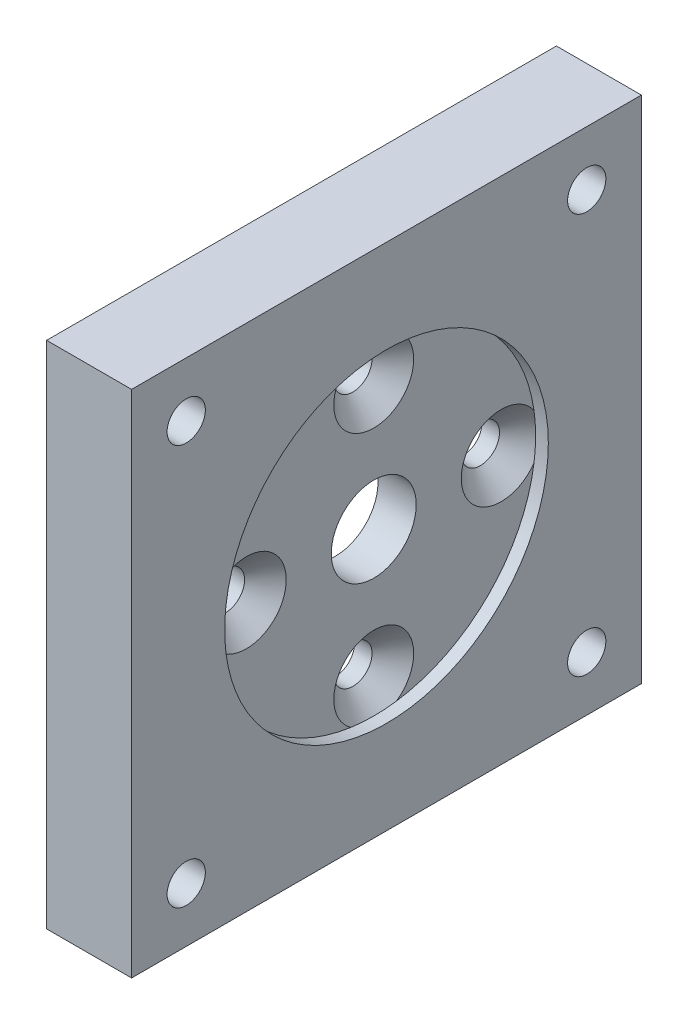
ISO-10303-21;
HEADER;
FILE_DESCRIPTION(('STEP AP214'),'2;1');
FILE_NAME('part.step','',(''),(''),'','','');
FILE_SCHEMA(('AUTOMOTIVE_DESIGN { 1 0 10303 214 1 1 1 1 }'));
ENDSEC;
DATA;
#1=APPLICATION_CONTEXT('core data for automotive mechanical design processes');
#2=APPLICATION_PROTOCOL_DEFINITION('international standard','automotive_design',2000,#1);
#3=PRODUCT_CONTEXT('',#1,'mechanical');
#4=PRODUCT('Part','Part','',(#3));
#5=PRODUCT_RELATED_PRODUCT_CATEGORY('part','',(#4));
#6=PRODUCT_DEFINITION_FORMATION('','',#4);
#7=PRODUCT_DEFINITION_CONTEXT('part definition',#1,'design');
#8=PRODUCT_DEFINITION('design','',#6,#7);
#9=PRODUCT_DEFINITION_SHAPE('','',#8);
#10=(LENGTH_UNIT() NAMED_UNIT(*) SI_UNIT(.MILLI.,.METRE.));
#11=(NAMED_UNIT(*) PLANE_ANGLE_UNIT() SI_UNIT($,.RADIAN.));
#12=(NAMED_UNIT(*) SI_UNIT($,.STERADIAN.) SOLID_ANGLE_UNIT());
#13=UNCERTAINTY_MEASURE_WITH_UNIT(LENGTH_MEASURE(1.E-05),#10,'distance_accuracy_value','');
#14=(GEOMETRIC_REPRESENTATION_CONTEXT(3) GLOBAL_UNCERTAINTY_ASSIGNED_CONTEXT((#13)) GLOBAL_UNIT_ASSIGNED_CONTEXT((#10,
#11,#12)) REPRESENTATION_CONTEXT('',''));
#15=CARTESIAN_POINT('',(0.,0.,0.));
#16=DIRECTION('',(0.,0.,1.));
#17=DIRECTION('',(1.,0.,0.));
#18=AXIS2_PLACEMENT_3D('',#15,#16,#17);
#19=CARTESIAN_POINT('',(0.,0.,0.));
#20=DIRECTION('',(1.,0.,0.));
#21=DIRECTION('',(0.,0.,-1.));
#22=AXIS2_PLACEMENT_3D('',#19,#20,#21);
#23=CYLINDRICAL_SURFACE('',#22,5.);
#24=CARTESIAN_POINT('',(8.5,0.,0.));
#25=DIRECTION('',(1.,0.,0.));
#26=DIRECTION('',(0.,0.,-1.));
#27=AXIS2_PLACEMENT_3D('',#24,#25,#26);
#28=CIRCLE('',#27,5.);
#29=CARTESIAN_POINT('',(8.5,0.,-5.));
#30=VERTEX_POINT('',#29);
#31=EDGE_CURVE('E130',#30,#30,#28,.F.);
#32=ORIENTED_EDGE('',*,*,#31,.F.);
#33=EDGE_LOOP('',(#32));
#34=FACE_BOUND('',#33,.T.);
#35=CARTESIAN_POINT('',(4.,0.,0.));
#36=DIRECTION('',(-1.,0.,0.));
#37=DIRECTION('',(0.,0.,1.));
#38=AXIS2_PLACEMENT_3D('',#35,#36,#37);
#39=CIRCLE('',#38,5.);
#40=CARTESIAN_POINT('',(4.,0.,5.));
#41=VERTEX_POINT('',#40);
#42=EDGE_CURVE('E142',#41,#41,#39,.F.);
#43=ORIENTED_EDGE('',*,*,#42,.F.);
#44=EDGE_LOOP('',(#43));
#45=FACE_BOUND('',#44,.T.);
#46=ADVANCED_FACE('F39',(#34,#45),#23,.F.);
#47=CARTESIAN_POINT('',(10.,30.,-30.));
#48=DIRECTION('',(0.,0.,1.));
#49=DIRECTION('',(0.,-1.,0.));
#50=AXIS2_PLACEMENT_3D('',#47,#48,#49);
#51=PLANE('',#50);
#52=DIRECTION('',(0.,1.,0.));
#53=VECTOR('',#52,1.);
#54=CARTESIAN_POINT('',(0.,30.,-30.));
#55=LINE('',#54,#53);
#56=CARTESIAN_POINT('',(0.,-30.,-30.));
#57=VERTEX_POINT('',#56);
#58=CARTESIAN_POINT('',(0.,30.,-30.));
#59=VERTEX_POINT('',#58);
#60=EDGE_CURVE('E133',#57,#59,#55,.T.);
#61=ORIENTED_EDGE('',*,*,#60,.T.);
#62=DIRECTION('',(-1.,0.,0.));
#63=VECTOR('',#62,1.);
#64=CARTESIAN_POINT('',(10.,30.,-30.));
#65=LINE('',#64,#63);
#66=CARTESIAN_POINT('',(10.,30.,-30.));
#67=VERTEX_POINT('',#66);
#68=EDGE_CURVE('E11',#67,#59,#65,.T.);
#69=ORIENTED_EDGE('',*,*,#68,.F.);
#70=DIRECTION('',(0.,1.,0.));
#71=VECTOR('',#70,1.);
#72=CARTESIAN_POINT('',(10.,30.,-30.));
#73=LINE('',#72,#71);
#74=CARTESIAN_POINT('',(10.,-30.,-30.));
#75=VERTEX_POINT('',#74);
#76=EDGE_CURVE('E230',#75,#67,#73,.T.);
#77=ORIENTED_EDGE('',*,*,#76,.F.);
#78=DIRECTION('',(-1.,0.,0.));
#79=VECTOR('',#78,1.);
#80=CARTESIAN_POINT('',(10.,-30.,-30.));
#81=LINE('',#80,#79);
#82=EDGE_CURVE('E231',#75,#57,#81,.T.);
#83=ORIENTED_EDGE('',*,*,#82,.T.);
#84=EDGE_LOOP('',(#61,#69,#77,#83));
#85=FACE_BOUND('',#84,.T.);
#86=ADVANCED_FACE('F41',(#85),#51,.F.);
#87=CARTESIAN_POINT('',(10.,30.,30.));
#88=DIRECTION('',(0.,-1.,0.));
#89=DIRECTION('',(0.,0.,-1.));
#90=AXIS2_PLACEMENT_3D('',#87,#88,#89);
#91=PLANE('',#90);
#92=DIRECTION('',(0.,0.,1.));
#93=VECTOR('',#92,1.);
#94=CARTESIAN_POINT('',(0.,30.,30.));
#95=LINE('',#94,#93);
#96=CARTESIAN_POINT('',(0.,30.,30.));
#97=VERTEX_POINT('',#96);
#98=EDGE_CURVE('E217',#59,#97,#95,.T.);
#99=ORIENTED_EDGE('',*,*,#98,.T.);
#100=DIRECTION('',(-1.,0.,0.));
#101=VECTOR('',#100,1.);
#102=CARTESIAN_POINT('',(10.,30.,30.));
#103=LINE('',#102,#101);
#104=CARTESIAN_POINT('',(10.,30.,30.));
#105=VERTEX_POINT('',#104);
#106=EDGE_CURVE('E48',#105,#97,#103,.T.);
#107=ORIENTED_EDGE('',*,*,#106,.F.);
#108=DIRECTION('',(0.,0.,1.));
#109=VECTOR('',#108,1.);
#110=CARTESIAN_POINT('',(10.,30.,30.));
#111=LINE('',#110,#109);
#112=EDGE_CURVE('E297',#67,#105,#111,.T.);
#113=ORIENTED_EDGE('',*,*,#112,.F.);
#114=ORIENTED_EDGE('',*,*,#68,.T.);
#115=EDGE_LOOP('',(#99,#107,#113,#114));
#116=FACE_BOUND('',#115,.T.);
#117=ADVANCED_FACE('F272',(#116),#91,.F.);
#118=CARTESIAN_POINT('',(10.,30.,30.));
#119=DIRECTION('',(0.,0.,-1.));
#120=DIRECTION('',(0.,1.,0.));
#121=AXIS2_PLACEMENT_3D('',#118,#119,#120);
#122=PLANE('',#121);
#123=DIRECTION('',(0.,-1.,0.));
#124=VECTOR('',#123,1.);
#125=CARTESIAN_POINT('',(0.,30.,30.));
#126=LINE('',#125,#124);
#127=CARTESIAN_POINT('',(0.,-30.,30.));
#128=VERTEX_POINT('',#127);
#129=EDGE_CURVE('E222',#97,#128,#126,.T.);
#130=ORIENTED_EDGE('',*,*,#129,.T.);
#131=DIRECTION('',(-1.,0.,0.));
#132=VECTOR('',#131,1.);
#133=CARTESIAN_POINT('',(10.,-30.,30.));
#134=LINE('',#133,#132);
#135=CARTESIAN_POINT('',(10.,-30.,30.));
#136=VERTEX_POINT('',#135);
#137=EDGE_CURVE('E233',#136,#128,#134,.T.);
#138=ORIENTED_EDGE('',*,*,#137,.F.);
#139=DIRECTION('',(0.,-1.,0.));
#140=VECTOR('',#139,1.);
#141=CARTESIAN_POINT('',(10.,30.,30.));
#142=LINE('',#141,#140);
#143=EDGE_CURVE('E294',#105,#136,#142,.T.);
#144=ORIENTED_EDGE('',*,*,#143,.F.);
#145=ORIENTED_EDGE('',*,*,#106,.T.);
#146=EDGE_LOOP('',(#130,#138,#144,#145));
#147=FACE_BOUND('',#146,.T.);
#148=ADVANCED_FACE('F283',(#147),#122,.F.);
#149=CARTESIAN_POINT('',(10.,-30.,30.));
#150=DIRECTION('',(0.,1.,0.));
#151=DIRECTION('',(0.,0.,1.));
#152=AXIS2_PLACEMENT_3D('',#149,#150,#151);
#153=PLANE('',#152);
#154=DIRECTION('',(0.,0.,-1.));
#155=VECTOR('',#154,1.);
#156=CARTESIAN_POINT('',(0.,-30.,30.));
#157=LINE('',#156,#155);
#158=EDGE_CURVE('E216',#128,#57,#157,.T.);
#159=ORIENTED_EDGE('',*,*,#158,.T.);
#160=ORIENTED_EDGE('',*,*,#82,.F.);
#161=DIRECTION('',(0.,0.,-1.));
#162=VECTOR('',#161,1.);
#163=CARTESIAN_POINT('',(10.,-30.,30.));
#164=LINE('',#163,#162);
#165=EDGE_CURVE('E225',#136,#75,#164,.T.);
#166=ORIENTED_EDGE('',*,*,#165,.F.);
#167=ORIENTED_EDGE('',*,*,#137,.T.);
#168=EDGE_LOOP('',(#159,#160,#166,#167));
#169=FACE_BOUND('',#168,.T.);
#170=ADVANCED_FACE('F278',(#169),#153,.F.);
#171=CARTESIAN_POINT('',(10.,-30.,-30.));
#172=DIRECTION('',(1.,0.,0.));
#173=DIRECTION('',(0.,0.,-1.));
#174=AXIS2_PLACEMENT_3D('',#171,#172,#173);
#175=PLANE('',#174);
#176=CARTESIAN_POINT('',(10.,23.57,23.57));
#177=DIRECTION('',(-1.,0.,0.));
#178=DIRECTION('',(0.,0.,1.));
#179=AXIS2_PLACEMENT_3D('',#176,#177,#178);
#180=CIRCLE('',#179,2.25);
#181=CARTESIAN_POINT('',(10.,23.57,25.82));
#182=VERTEX_POINT('',#181);
#183=EDGE_CURVE('E177',#182,#182,#180,.T.);
#184=ORIENTED_EDGE('',*,*,#183,.T.);
#185=EDGE_LOOP('',(#184));
#186=FACE_BOUND('',#185,.T.);
#187=CARTESIAN_POINT('',(10.,-23.57,23.57));
#188=DIRECTION('',(-1.,0.,0.));
#189=DIRECTION('',(0.,0.,1.));
#190=AXIS2_PLACEMENT_3D('',#187,#188,#189);
#191=CIRCLE('',#190,2.25);
#192=CARTESIAN_POINT('',(10.,-23.57,25.82));
#193=VERTEX_POINT('',#192);
#194=EDGE_CURVE('E176',#193,#193,#191,.T.);
#195=ORIENTED_EDGE('',*,*,#194,.T.);
#196=EDGE_LOOP('',(#195));
#197=FACE_BOUND('',#196,.T.);
#198=CARTESIAN_POINT('',(10.,-23.57,-23.57));
#199=DIRECTION('',(-1.,0.,0.));
#200=DIRECTION('',(0.,0.,1.));
#201=AXIS2_PLACEMENT_3D('',#198,#199,#200);
#202=CIRCLE('',#201,2.25);
#203=CARTESIAN_POINT('',(10.,-23.57,-21.32));
#204=VERTEX_POINT('',#203);
#205=EDGE_CURVE('E184',#204,#204,#202,.T.);
#206=ORIENTED_EDGE('',*,*,#205,.T.);
#207=EDGE_LOOP('',(#206));
#208=FACE_BOUND('',#207,.T.);
#209=CARTESIAN_POINT('',(10.,23.57,-23.57));
#210=DIRECTION('',(-1.,0.,0.));
#211=DIRECTION('',(0.,0.,1.));
#212=AXIS2_PLACEMENT_3D('',#209,#210,#211);
#213=CIRCLE('',#212,2.25);
#214=CARTESIAN_POINT('',(10.,23.57,-21.32));
#215=VERTEX_POINT('',#214);
#216=EDGE_CURVE('E193',#215,#215,#213,.T.);
#217=ORIENTED_EDGE('',*,*,#216,.T.);
#218=EDGE_LOOP('',(#217));
#219=FACE_BOUND('',#218,.T.);
#220=CARTESIAN_POINT('',(10.,0.,0.));
#221=DIRECTION('',(1.,0.,0.));
#222=DIRECTION('',(0.,0.,-1.));
#223=AXIS2_PLACEMENT_3D('',#220,#221,#222);
#224=CIRCLE('',#223,19.05);
#225=CARTESIAN_POINT('',(10.,0.,-19.05));
#226=VERTEX_POINT('',#225);
#227=EDGE_CURVE('E135',#226,#226,#224,.T.);
#228=ORIENTED_EDGE('',*,*,#227,.F.);
#229=EDGE_LOOP('',(#228));
#230=FACE_BOUND('',#229,.T.);
#231=ORIENTED_EDGE('',*,*,#76,.T.);
#232=ORIENTED_EDGE('',*,*,#112,.T.);
#233=ORIENTED_EDGE('',*,*,#143,.T.);
#234=ORIENTED_EDGE('',*,*,#165,.T.);
#235=EDGE_LOOP('',(#231,#232,#233,#234));
#236=FACE_BOUND('',#235,.T.);
#237=ADVANCED_FACE('F209',(#186,#197,#208,#219,#230,#236),#175,.T.);
#238=CARTESIAN_POINT('',(0.,-30.,-30.));
#239=DIRECTION('',(1.,0.,0.));
#240=DIRECTION('',(0.,0.,-1.));
#241=AXIS2_PLACEMENT_3D('',#238,#239,#240);
#242=PLANE('',#241);
#243=CARTESIAN_POINT('',(0.,23.57,23.57));
#244=DIRECTION('',(-1.,0.,0.));
#245=DIRECTION('',(0.,0.,1.));
#246=AXIS2_PLACEMENT_3D('',#243,#244,#245);
#247=CIRCLE('',#246,2.25);
#248=CARTESIAN_POINT('',(0.,23.57,25.82));
#249=VERTEX_POINT('',#248);
#250=EDGE_CURVE('E173',#249,#249,#247,.T.);
#251=ORIENTED_EDGE('',*,*,#250,.F.);
#252=EDGE_LOOP('',(#251));
#253=FACE_BOUND('',#252,.T.);
#254=CARTESIAN_POINT('',(0.,-23.57,23.57));
#255=DIRECTION('',(-1.,0.,0.));
#256=DIRECTION('',(0.,0.,1.));
#257=AXIS2_PLACEMENT_3D('',#254,#255,#256);
#258=CIRCLE('',#257,2.25);
#259=CARTESIAN_POINT('',(0.,-23.57,25.82));
#260=VERTEX_POINT('',#259);
#261=EDGE_CURVE('E181',#260,#260,#258,.T.);
#262=ORIENTED_EDGE('',*,*,#261,.F.);
#263=EDGE_LOOP('',(#262));
#264=FACE_BOUND('',#263,.T.);
#265=CARTESIAN_POINT('',(0.,-23.57,-23.57));
#266=DIRECTION('',(-1.,0.,0.));
#267=DIRECTION('',(0.,0.,1.));
#268=AXIS2_PLACEMENT_3D('',#265,#266,#267);
#269=CIRCLE('',#268,2.25);
#270=CARTESIAN_POINT('',(0.,-23.57,-21.32));
#271=VERTEX_POINT('',#270);
#272=EDGE_CURVE('E187',#271,#271,#269,.T.);
#273=ORIENTED_EDGE('',*,*,#272,.F.);
#274=EDGE_LOOP('',(#273));
#275=FACE_BOUND('',#274,.T.);
#276=CARTESIAN_POINT('',(0.,23.57,-23.57));
#277=DIRECTION('',(-1.,0.,0.));
#278=DIRECTION('',(0.,0.,1.));
#279=AXIS2_PLACEMENT_3D('',#276,#277,#278);
#280=CIRCLE('',#279,2.25);
#281=CARTESIAN_POINT('',(0.,23.57,-21.32));
#282=VERTEX_POINT('',#281);
#283=EDGE_CURVE('E190',#282,#282,#280,.T.);
#284=ORIENTED_EDGE('',*,*,#283,.F.);
#285=EDGE_LOOP('',(#284));
#286=FACE_BOUND('',#285,.T.);
#287=CARTESIAN_POINT('',(0.,0.,0.));
#288=DIRECTION('',(-1.,0.,0.));
#289=DIRECTION('',(0.,0.,1.));
#290=AXIS2_PLACEMENT_3D('',#287,#288,#289);
#291=CIRCLE('',#290,22.4);
#292=CARTESIAN_POINT('',(0.,0.,22.4));
#293=VERTEX_POINT('',#292);
#294=EDGE_CURVE('E196',#293,#293,#291,.T.);
#295=ORIENTED_EDGE('',*,*,#294,.F.);
#296=EDGE_LOOP('',(#295));
#297=FACE_BOUND('',#296,.T.);
#298=ORIENTED_EDGE('',*,*,#60,.F.);
#299=ORIENTED_EDGE('',*,*,#158,.F.);
#300=ORIENTED_EDGE('',*,*,#129,.F.);
#301=ORIENTED_EDGE('',*,*,#98,.F.);
#302=EDGE_LOOP('',(#298,#299,#300,#301));
#303=FACE_BOUND('',#302,.T.);
#304=ADVANCED_FACE('F206',(#253,#264,#275,#286,#297,#303),#242,.F.);
#305=CARTESIAN_POINT('',(8.5,0.,0.));
#306=DIRECTION('',(1.,0.,0.));
#307=DIRECTION('',(0.,0.,-1.));
#308=AXIS2_PLACEMENT_3D('',#305,#306,#307);
#309=PLANE('',#308);
#310=CARTESIAN_POINT('',(8.5,15.,0.));
#311=DIRECTION('',(1.,0.,0.));
#312=DIRECTION('',(0.,0.,-1.));
#313=AXIS2_PLACEMENT_3D('',#310,#311,#312);
#314=CIRCLE('',#313,4.7);
#315=CARTESIAN_POINT('',(8.5,18.8604166666667,2.68089223202317));
#316=VERTEX_POINT('',#315);
#317=CARTESIAN_POINT('',(8.5,18.8604166666667,-2.68089223202317));
#318=VERTEX_POINT('',#317);
#319=EDGE_CURVE('E116',#316,#318,#314,.T.);
#320=ORIENTED_EDGE('',*,*,#319,.F.);
#321=CARTESIAN_POINT('',(8.5,0.,0.));
#322=DIRECTION('',(1.,0.,0.));
#323=DIRECTION('',(0.,0.,-1.));
#324=AXIS2_PLACEMENT_3D('',#321,#322,#323);
#325=CIRCLE('',#324,19.05);
#326=CARTESIAN_POINT('',(8.5,2.68089223202435,18.8604166666665));
#327=VERTEX_POINT('',#326);
#328=EDGE_CURVE('E63',#316,#327,#325,.T.);
#329=ORIENTED_EDGE('',*,*,#328,.T.);
#330=CARTESIAN_POINT('',(8.5,0.,15.));
#331=DIRECTION('',(1.,0.,0.));
#332=DIRECTION('',(0.,0.,-1.));
#333=AXIS2_PLACEMENT_3D('',#330,#331,#332);
#334=CIRCLE('',#333,4.7);
#335=CARTESIAN_POINT('',(8.5,-2.68089223202318,18.8604166666667));
#336=VERTEX_POINT('',#335);
#337=EDGE_CURVE('E152',#336,#327,#334,.T.);
#338=ORIENTED_EDGE('',*,*,#337,.F.);
#339=CARTESIAN_POINT('',(8.5,-18.8604166666665,2.68089223202435));
#340=VERTEX_POINT('',#339);
#341=EDGE_CURVE('E113',#336,#340,#325,.T.);
#342=ORIENTED_EDGE('',*,*,#341,.T.);
#343=CARTESIAN_POINT('',(8.5,-15.,0.));
#344=DIRECTION('',(1.,0.,0.));
#345=DIRECTION('',(0.,0.,-1.));
#346=AXIS2_PLACEMENT_3D('',#343,#344,#345);
#347=CIRCLE('',#346,4.7);
#348=CARTESIAN_POINT('',(8.5,-18.8604166666667,-2.68089223202317));
#349=VERTEX_POINT('',#348);
#350=EDGE_CURVE('E149',#349,#340,#347,.T.);
#351=ORIENTED_EDGE('',*,*,#350,.F.);
#352=CARTESIAN_POINT('',(8.5,-2.68089223202318,-18.8604166666667));
#353=VERTEX_POINT('',#352);
#354=EDGE_CURVE('E127',#349,#353,#325,.T.);
#355=ORIENTED_EDGE('',*,*,#354,.T.);
#356=CARTESIAN_POINT('',(8.5,0.,-15.));
#357=DIRECTION('',(1.,0.,0.));
#358=DIRECTION('',(0.,0.,-1.));
#359=AXIS2_PLACEMENT_3D('',#356,#357,#358);
#360=CIRCLE('',#359,4.7);
#361=CARTESIAN_POINT('',(8.5,2.68089223202318,-18.8604166666667));
#362=VERTEX_POINT('',#361);
#363=EDGE_CURVE('E161',#362,#353,#360,.T.);
#364=ORIENTED_EDGE('',*,*,#363,.F.);
#365=EDGE_CURVE('E111',#362,#318,#325,.T.);
#366=ORIENTED_EDGE('',*,*,#365,.T.);
#367=EDGE_LOOP('',(#320,#329,#338,#342,#351,#355,#364,#366));
#368=FACE_BOUND('',#367,.T.);
#369=ORIENTED_EDGE('',*,*,#31,.T.);
#370=EDGE_LOOP('',(#369));
#371=FACE_BOUND('',#370,.T.);
#372=ADVANCED_FACE('F119',(#368,#371),#309,.T.);
#373=CARTESIAN_POINT('',(8.5,0.,0.));
#374=DIRECTION('',(1.,0.,0.));
#375=DIRECTION('',(0.,0.,-1.));
#376=AXIS2_PLACEMENT_3D('',#373,#374,#375);
#377=CYLINDRICAL_SURFACE('',#376,19.05);
#378=ORIENTED_EDGE('',*,*,#365,.F.);
#379=EDGE_CURVE('E131',#353,#362,#325,.T.);
#380=ORIENTED_EDGE('',*,*,#379,.F.);
#381=ORIENTED_EDGE('',*,*,#354,.F.);
#382=EDGE_CURVE('E136',#340,#349,#325,.T.);
#383=ORIENTED_EDGE('',*,*,#382,.F.);
#384=ORIENTED_EDGE('',*,*,#341,.F.);
#385=EDGE_CURVE('E126',#327,#336,#325,.T.);
#386=ORIENTED_EDGE('',*,*,#385,.F.);
#387=ORIENTED_EDGE('',*,*,#328,.F.);
#388=EDGE_CURVE('E106',#318,#316,#325,.T.);
#389=ORIENTED_EDGE('',*,*,#388,.F.);
#390=EDGE_LOOP('',(#378,#380,#381,#383,#384,#386,#387,#389));
#391=FACE_BOUND('',#390,.T.);
#392=ORIENTED_EDGE('',*,*,#227,.T.);
#393=EDGE_LOOP('',(#392));
#394=FACE_BOUND('',#393,.T.);
#395=ADVANCED_FACE('F123',(#391,#394),#377,.F.);
#396=CARTESIAN_POINT('',(4.,0.,0.));
#397=DIRECTION('',(-1.,0.,0.));
#398=DIRECTION('',(0.,0.,1.));
#399=AXIS2_PLACEMENT_3D('',#396,#397,#398);
#400=PLANE('',#399);
#401=CARTESIAN_POINT('',(4.,15.,0.));
#402=DIRECTION('',(-1.,0.,0.));
#403=DIRECTION('',(0.,0.,1.));
#404=AXIS2_PLACEMENT_3D('',#401,#402,#403);
#405=CIRCLE('',#404,2.25);
#406=CARTESIAN_POINT('',(4.,15.,2.25));
#407=VERTEX_POINT('',#406);
#408=EDGE_CURVE('E43',#407,#407,#405,.T.);
#409=ORIENTED_EDGE('',*,*,#408,.F.);
#410=EDGE_LOOP('',(#409));
#411=FACE_BOUND('',#410,.T.);
#412=CARTESIAN_POINT('',(4.,0.,15.));
#413=DIRECTION('',(-1.,0.,0.));
#414=DIRECTION('',(0.,0.,1.));
#415=AXIS2_PLACEMENT_3D('',#412,#413,#414);
#416=CIRCLE('',#415,2.25);
#417=CARTESIAN_POINT('',(4.,0.,17.25));
#418=VERTEX_POINT('',#417);
#419=EDGE_CURVE('E244',#418,#418,#416,.T.);
#420=ORIENTED_EDGE('',*,*,#419,.F.);
#421=EDGE_LOOP('',(#420));
#422=FACE_BOUND('',#421,.T.);
#423=CARTESIAN_POINT('',(4.,-15.,0.));
#424=DIRECTION('',(-1.,0.,0.));
#425=DIRECTION('',(0.,0.,1.));
#426=AXIS2_PLACEMENT_3D('',#423,#424,#425);
#427=CIRCLE('',#426,2.25);
#428=CARTESIAN_POINT('',(4.,-15.,2.25));
#429=VERTEX_POINT('',#428);
#430=EDGE_CURVE('E242',#429,#429,#427,.T.);
#431=ORIENTED_EDGE('',*,*,#430,.F.);
#432=EDGE_LOOP('',(#431));
#433=FACE_BOUND('',#432,.T.);
#434=CARTESIAN_POINT('',(4.,0.,-15.));
#435=DIRECTION('',(-1.,0.,0.));
#436=DIRECTION('',(0.,0.,1.));
#437=AXIS2_PLACEMENT_3D('',#434,#435,#436);
#438=CIRCLE('',#437,2.25);
#439=CARTESIAN_POINT('',(4.,0.,-12.75));
#440=VERTEX_POINT('',#439);
#441=EDGE_CURVE('E180',#440,#440,#438,.T.);
#442=ORIENTED_EDGE('',*,*,#441,.F.);
#443=EDGE_LOOP('',(#442));
#444=FACE_BOUND('',#443,.T.);
#445=CARTESIAN_POINT('',(4.,0.,0.));
#446=DIRECTION('',(-1.,0.,0.));
#447=DIRECTION('',(0.,0.,1.));
#448=AXIS2_PLACEMENT_3D('',#445,#446,#447);
#449=CIRCLE('',#448,22.4);
#450=CARTESIAN_POINT('',(4.,0.,22.4));
#451=VERTEX_POINT('',#450);
#452=EDGE_CURVE('E199',#451,#451,#449,.T.);
#453=ORIENTED_EDGE('',*,*,#452,.T.);
#454=EDGE_LOOP('',(#453));
#455=FACE_BOUND('',#454,.T.);
#456=ORIENTED_EDGE('',*,*,#42,.T.);
#457=EDGE_LOOP('',(#456));
#458=FACE_BOUND('',#457,.T.);
#459=ADVANCED_FACE('F253',(#411,#422,#433,#444,#455,#458),#400,.T.);
#460=CARTESIAN_POINT('',(4.,0.,0.));
#461=DIRECTION('',(-1.,0.,0.));
#462=DIRECTION('',(0.,0.,1.));
#463=AXIS2_PLACEMENT_3D('',#460,#461,#462);
#464=CYLINDRICAL_SURFACE('',#463,22.4);
#465=ORIENTED_EDGE('',*,*,#452,.F.);
#466=EDGE_LOOP('',(#465));
#467=FACE_BOUND('',#466,.T.);
#468=ORIENTED_EDGE('',*,*,#294,.T.);
#469=EDGE_LOOP('',(#468));
#470=FACE_BOUND('',#469,.T.);
#471=ADVANCED_FACE('F204',(#467,#470),#464,.F.);
#472=CARTESIAN_POINT('',(10.,23.57,-23.57));
#473=DIRECTION('',(-1.,0.,0.));
#474=DIRECTION('',(0.,0.,1.));
#475=AXIS2_PLACEMENT_3D('',#472,#473,#474);
#476=CYLINDRICAL_SURFACE('',#475,2.25);
#477=ORIENTED_EDGE('',*,*,#216,.F.);
#478=EDGE_LOOP('',(#477));
#479=FACE_BOUND('',#478,.T.);
#480=ORIENTED_EDGE('',*,*,#283,.T.);
#481=EDGE_LOOP('',(#480));
#482=FACE_BOUND('',#481,.T.);
#483=ADVANCED_FACE('F341',(#479,#482),#476,.F.);
#484=CARTESIAN_POINT('',(10.,-23.57,-23.57));
#485=DIRECTION('',(-1.,0.,0.));
#486=DIRECTION('',(0.,0.,1.));
#487=AXIS2_PLACEMENT_3D('',#484,#485,#486);
#488=CYLINDRICAL_SURFACE('',#487,2.25);
#489=ORIENTED_EDGE('',*,*,#205,.F.);
#490=EDGE_LOOP('',(#489));
#491=FACE_BOUND('',#490,.T.);
#492=ORIENTED_EDGE('',*,*,#272,.T.);
#493=EDGE_LOOP('',(#492));
#494=FACE_BOUND('',#493,.T.);
#495=ADVANCED_FACE('F349',(#491,#494),#488,.F.);
#496=CARTESIAN_POINT('',(10.,-23.57,23.57));
#497=DIRECTION('',(-1.,0.,0.));
#498=DIRECTION('',(0.,0.,1.));
#499=AXIS2_PLACEMENT_3D('',#496,#497,#498);
#500=CYLINDRICAL_SURFACE('',#499,2.25);
#501=ORIENTED_EDGE('',*,*,#194,.F.);
#502=EDGE_LOOP('',(#501));
#503=FACE_BOUND('',#502,.T.);
#504=ORIENTED_EDGE('',*,*,#261,.T.);
#505=EDGE_LOOP('',(#504));
#506=FACE_BOUND('',#505,.T.);
#507=ADVANCED_FACE('F357',(#503,#506),#500,.F.);
#508=CARTESIAN_POINT('',(10.,23.57,23.57));
#509=DIRECTION('',(-1.,0.,0.));
#510=DIRECTION('',(0.,0.,1.));
#511=AXIS2_PLACEMENT_3D('',#508,#509,#510);
#512=CYLINDRICAL_SURFACE('',#511,2.25);
#513=ORIENTED_EDGE('',*,*,#183,.F.);
#514=EDGE_LOOP('',(#513));
#515=FACE_BOUND('',#514,.T.);
#516=ORIENTED_EDGE('',*,*,#250,.T.);
#517=EDGE_LOOP('',(#516));
#518=FACE_BOUND('',#517,.T.);
#519=ADVANCED_FACE('F365',(#515,#518),#512,.F.);
#520=CARTESIAN_POINT('',(0.,0.,-15.));
#521=DIRECTION('',(1.,0.,0.));
#522=DIRECTION('',(0.,0.,-1.));
#523=AXIS2_PLACEMENT_3D('',#520,#521,#522);
#524=CYLINDRICAL_SURFACE('',#523,2.25);
#525=CARTESIAN_POINT('',(6.05,0.,-15.));
#526=DIRECTION('',(1.,0.,0.));
#527=DIRECTION('',(0.,0.,-1.));
#528=AXIS2_PLACEMENT_3D('',#525,#526,#527);
#529=CIRCLE('',#528,2.25);
#530=CARTESIAN_POINT('',(6.05,0.,-17.25));
#531=VERTEX_POINT('',#530);
#532=EDGE_CURVE('E165',#531,#531,#529,.T.);
#533=ORIENTED_EDGE('',*,*,#532,.T.);
#534=EDGE_LOOP('',(#533));
#535=FACE_BOUND('',#534,.T.);
#536=ORIENTED_EDGE('',*,*,#441,.T.);
#537=EDGE_LOOP('',(#536));
#538=FACE_BOUND('',#537,.T.);
#539=ADVANCED_FACE('F373',(#535,#538),#524,.F.);
#540=CARTESIAN_POINT('',(0.,-15.,0.));
#541=DIRECTION('',(1.,0.,0.));
#542=DIRECTION('',(0.,0.,-1.));
#543=AXIS2_PLACEMENT_3D('',#540,#541,#542);
#544=CYLINDRICAL_SURFACE('',#543,2.25);
#545=CARTESIAN_POINT('',(6.05,-15.,0.));
#546=DIRECTION('',(1.,0.,0.));
#547=DIRECTION('',(0.,0.,-1.));
#548=AXIS2_PLACEMENT_3D('',#545,#546,#547);
#549=CIRCLE('',#548,2.25);
#550=CARTESIAN_POINT('',(6.05,-15.,-2.25));
#551=VERTEX_POINT('',#550);
#552=EDGE_CURVE('E156',#551,#551,#549,.T.);
#553=ORIENTED_EDGE('',*,*,#552,.T.);
#554=EDGE_LOOP('',(#553));
#555=FACE_BOUND('',#554,.T.);
#556=ORIENTED_EDGE('',*,*,#430,.T.);
#557=EDGE_LOOP('',(#556));
#558=FACE_BOUND('',#557,.T.);
#559=ADVANCED_FACE('F381',(#555,#558),#544,.F.);
#560=CARTESIAN_POINT('',(0.,0.,15.));
#561=DIRECTION('',(1.,0.,0.));
#562=DIRECTION('',(0.,0.,-1.));
#563=AXIS2_PLACEMENT_3D('',#560,#561,#562);
#564=CYLINDRICAL_SURFACE('',#563,2.25);
#565=CARTESIAN_POINT('',(6.05,0.,15.));
#566=DIRECTION('',(1.,0.,0.));
#567=DIRECTION('',(0.,0.,-1.));
#568=AXIS2_PLACEMENT_3D('',#565,#566,#567);
#569=CIRCLE('',#568,2.25);
#570=CARTESIAN_POINT('',(6.05,0.,12.75));
#571=VERTEX_POINT('',#570);
#572=EDGE_CURVE('E159',#571,#571,#569,.T.);
#573=ORIENTED_EDGE('',*,*,#572,.T.);
#574=EDGE_LOOP('',(#573));
#575=FACE_BOUND('',#574,.T.);
#576=ORIENTED_EDGE('',*,*,#419,.T.);
#577=EDGE_LOOP('',(#576));
#578=FACE_BOUND('',#577,.T.);
#579=ADVANCED_FACE('F389',(#575,#578),#564,.F.);
#580=CARTESIAN_POINT('',(0.,15.,0.));
#581=DIRECTION('',(1.,0.,0.));
#582=DIRECTION('',(0.,0.,-1.));
#583=AXIS2_PLACEMENT_3D('',#580,#581,#582);
#584=CYLINDRICAL_SURFACE('',#583,2.25);
#585=CARTESIAN_POINT('',(6.05,15.,0.));
#586=DIRECTION('',(1.,0.,0.));
#587=DIRECTION('',(0.,0.,-1.));
#588=AXIS2_PLACEMENT_3D('',#585,#586,#587);
#589=CIRCLE('',#588,2.25);
#590=CARTESIAN_POINT('',(6.05,15.,-2.25));
#591=VERTEX_POINT('',#590);
#592=EDGE_CURVE('E117',#591,#591,#589,.T.);
#593=ORIENTED_EDGE('',*,*,#592,.T.);
#594=EDGE_LOOP('',(#593));
#595=FACE_BOUND('',#594,.T.);
#596=ORIENTED_EDGE('',*,*,#408,.T.);
#597=EDGE_LOOP('',(#596));
#598=FACE_BOUND('',#597,.T.);
#599=ADVANCED_FACE('F251',(#595,#598),#584,.F.);
#600=CARTESIAN_POINT('',(8.5,4.7,-15.));
#601=DIRECTION('',(1.,0.,0.));
#602=DIRECTION('',(0.,0.,-1.));
#603=AXIS2_PLACEMENT_3D('',#600,#601,#602);
#604=PLANE('',#603);
#605=EDGE_CURVE('E164',#353,#362,#360,.T.);
#606=ORIENTED_EDGE('',*,*,#605,.F.);
#607=ORIENTED_EDGE('',*,*,#379,.T.);
#608=EDGE_LOOP('',(#606,#607));
#609=FACE_BOUND('',#608,.T.);
#610=ADVANCED_FACE('F167',(#609),#604,.F.);
#611=CARTESIAN_POINT('',(8.5,0.,-15.));
#612=DIRECTION('',(1.,0.,0.));
#613=DIRECTION('',(0.,0.,-1.));
#614=AXIS2_PLACEMENT_3D('',#611,#612,#613);
#615=CONICAL_SURFACE('',#614,4.7,0.785398163397448);
#616=ORIENTED_EDGE('',*,*,#532,.F.);
#617=EDGE_LOOP('',(#616));
#618=FACE_BOUND('',#617,.T.);
#619=ORIENTED_EDGE('',*,*,#363,.T.);
#620=ORIENTED_EDGE('',*,*,#605,.T.);
#621=EDGE_LOOP('',(#619,#620));
#622=FACE_BOUND('',#621,.T.);
#623=ADVANCED_FACE('F163',(#618,#622),#615,.F.);
#624=CARTESIAN_POINT('',(8.5,-10.3,0.));
#625=DIRECTION('',(1.,0.,0.));
#626=DIRECTION('',(0.,0.,-1.));
#627=AXIS2_PLACEMENT_3D('',#624,#625,#626);
#628=PLANE('',#627);
#629=EDGE_CURVE('E153',#340,#349,#347,.T.);
#630=ORIENTED_EDGE('',*,*,#629,.F.);
#631=ORIENTED_EDGE('',*,*,#382,.T.);
#632=EDGE_LOOP('',(#630,#631));
#633=FACE_BOUND('',#632,.T.);
#634=ADVANCED_FACE('F154',(#633),#628,.F.);
#635=CARTESIAN_POINT('',(8.5,-15.,0.));
#636=DIRECTION('',(1.,0.,0.));
#637=DIRECTION('',(0.,0.,-1.));
#638=AXIS2_PLACEMENT_3D('',#635,#636,#637);
#639=CONICAL_SURFACE('',#638,4.7,0.785398163397448);
#640=ORIENTED_EDGE('',*,*,#552,.F.);
#641=EDGE_LOOP('',(#640));
#642=FACE_BOUND('',#641,.T.);
#643=ORIENTED_EDGE('',*,*,#629,.T.);
#644=ORIENTED_EDGE('',*,*,#350,.T.);
#645=EDGE_LOOP('',(#643,#644));
#646=FACE_BOUND('',#645,.T.);
#647=ADVANCED_FACE('F158',(#642,#646),#639,.F.);
#648=CARTESIAN_POINT('',(8.5,4.7,15.));
#649=DIRECTION('',(1.,0.,0.));
#650=DIRECTION('',(0.,0.,-1.));
#651=AXIS2_PLACEMENT_3D('',#648,#649,#650);
#652=PLANE('',#651);
#653=EDGE_CURVE('E577',#327,#336,#334,.T.);
#654=ORIENTED_EDGE('',*,*,#653,.F.);
#655=ORIENTED_EDGE('',*,*,#385,.T.);
#656=EDGE_LOOP('',(#654,#655));
#657=FACE_BOUND('',#656,.T.);
#658=ADVANCED_FACE('F430',(#657),#652,.F.);
#659=CARTESIAN_POINT('',(8.5,0.,15.));
#660=DIRECTION('',(1.,0.,0.));
#661=DIRECTION('',(0.,0.,-1.));
#662=AXIS2_PLACEMENT_3D('',#659,#660,#661);
#663=CONICAL_SURFACE('',#662,4.7,0.785398163397448);
#664=ORIENTED_EDGE('',*,*,#572,.F.);
#665=EDGE_LOOP('',(#664));
#666=FACE_BOUND('',#665,.T.);
#667=ORIENTED_EDGE('',*,*,#653,.T.);
#668=ORIENTED_EDGE('',*,*,#337,.T.);
#669=EDGE_LOOP('',(#667,#668));
#670=FACE_BOUND('',#669,.T.);
#671=ADVANCED_FACE('F438',(#666,#670),#663,.F.);
#672=CARTESIAN_POINT('',(8.5,19.7,0.));
#673=DIRECTION('',(1.,0.,0.));
#674=DIRECTION('',(0.,0.,-1.));
#675=AXIS2_PLACEMENT_3D('',#672,#673,#674);
#676=PLANE('',#675);
#677=EDGE_CURVE('E55',#318,#316,#314,.T.);
#678=ORIENTED_EDGE('',*,*,#677,.F.);
#679=ORIENTED_EDGE('',*,*,#388,.T.);
#680=EDGE_LOOP('',(#678,#679));
#681=FACE_BOUND('',#680,.T.);
#682=ADVANCED_FACE('F107',(#681),#676,.F.);
#683=CARTESIAN_POINT('',(8.5,15.,0.));
#684=DIRECTION('',(1.,0.,0.));
#685=DIRECTION('',(0.,0.,-1.));
#686=AXIS2_PLACEMENT_3D('',#683,#684,#685);
#687=CONICAL_SURFACE('',#686,4.7,0.785398163397448);
#688=ORIENTED_EDGE('',*,*,#592,.F.);
#689=EDGE_LOOP('',(#688));
#690=FACE_BOUND('',#689,.T.);
#691=ORIENTED_EDGE('',*,*,#677,.T.);
#692=ORIENTED_EDGE('',*,*,#319,.T.);
#693=EDGE_LOOP('',(#691,#692));
#694=FACE_BOUND('',#693,.T.);
#695=ADVANCED_FACE('F115',(#690,#694),#687,.F.);
#696=CLOSED_SHELL('',(#46,#86,#117,#148,#170,#237,#304,#372,#395,#459,#471,#483,#495,#507,#519,
#539,#559,#579,#599,#610,#623,#634,#647,#658,#671,#682,#695));
#697=MANIFOLD_SOLID_BREP('B2',#696);
#698=ADVANCED_BREP_SHAPE_REPRESENTATION('',(#18,#697),#14);
#699=SHAPE_DEFINITION_REPRESENTATION(#9,#698);
ENDSEC;
END-ISO-10303-21;
